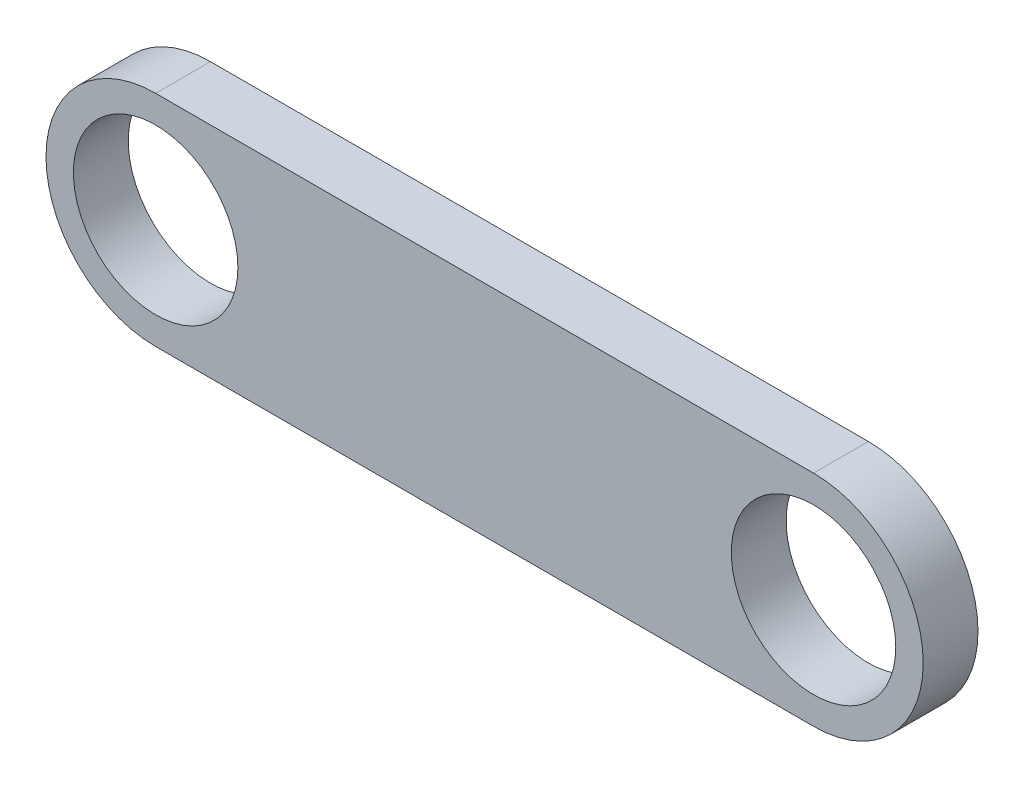
ISO-10303-21;
HEADER;
FILE_DESCRIPTION(('STEP AP214'),'2;1');
FILE_NAME('part.step','',(''),(''),'','','');
FILE_SCHEMA(('AUTOMOTIVE_DESIGN { 1 0 10303 214 1 1 1 1 }'));
ENDSEC;
DATA;
#1=APPLICATION_CONTEXT('core data for automotive mechanical design processes');
#2=APPLICATION_PROTOCOL_DEFINITION('international standard','automotive_design',2000,#1);
#3=PRODUCT_CONTEXT('',#1,'mechanical');
#4=PRODUCT('Part','Part','',(#3));
#5=PRODUCT_RELATED_PRODUCT_CATEGORY('part','',(#4));
#6=PRODUCT_DEFINITION_FORMATION('','',#4);
#7=PRODUCT_DEFINITION_CONTEXT('part definition',#1,'design');
#8=PRODUCT_DEFINITION('design','',#6,#7);
#9=PRODUCT_DEFINITION_SHAPE('','',#8);
#10=(LENGTH_UNIT() NAMED_UNIT(*) SI_UNIT(.MILLI.,.METRE.));
#11=(NAMED_UNIT(*) PLANE_ANGLE_UNIT() SI_UNIT($,.RADIAN.));
#12=(NAMED_UNIT(*) SI_UNIT($,.STERADIAN.) SOLID_ANGLE_UNIT());
#13=UNCERTAINTY_MEASURE_WITH_UNIT(LENGTH_MEASURE(1.E-05),#10,'distance_accuracy_value','');
#14=(GEOMETRIC_REPRESENTATION_CONTEXT(3) GLOBAL_UNCERTAINTY_ASSIGNED_CONTEXT((#13)) GLOBAL_UNIT_ASSIGNED_CONTEXT((#10,
#11,#12)) REPRESENTATION_CONTEXT('',''));
#15=CARTESIAN_POINT('',(0.,0.,0.));
#16=DIRECTION('',(0.,0.,1.));
#17=DIRECTION('',(1.,0.,0.));
#18=AXIS2_PLACEMENT_3D('',#15,#16,#17);
#19=CARTESIAN_POINT('',(0.,0.,10.));
#20=DIRECTION('',(0.,0.,1.));
#21=DIRECTION('',(1.,0.,0.));
#22=AXIS2_PLACEMENT_3D('',#19,#20,#21);
#23=PLANE('',#22);
#24=CARTESIAN_POINT('',(0.,0.,10.));
#25=DIRECTION('',(0.,0.,1.));
#26=DIRECTION('',(1.,0.,0.));
#27=AXIS2_PLACEMENT_3D('',#24,#25,#26);
#28=CIRCLE('',#27,15.);
#29=CARTESIAN_POINT('',(15.,0.,10.));
#30=VERTEX_POINT('',#29);
#31=EDGE_CURVE('E116',#30,#30,#28,.T.);
#32=ORIENTED_EDGE('',*,*,#31,.F.);
#33=EDGE_LOOP('',(#32));
#34=FACE_BOUND('',#33,.T.);
#35=CARTESIAN_POINT('',(0.,0.,10.));
#36=DIRECTION('',(0.,0.,1.));
#37=DIRECTION('',(1.,0.,0.));
#38=AXIS2_PLACEMENT_3D('',#35,#36,#37);
#39=CIRCLE('',#38,20.);
#40=CARTESIAN_POINT('',(0.,20.,10.));
#41=VERTEX_POINT('',#40);
#42=CARTESIAN_POINT('',(0.,-20.,10.));
#43=VERTEX_POINT('',#42);
#44=EDGE_CURVE('E96',#41,#43,#39,.T.);
#45=ORIENTED_EDGE('',*,*,#44,.T.);
#46=DIRECTION('',(1.,0.,0.));
#47=VECTOR('',#46,1.);
#48=CARTESIAN_POINT('',(0.,-20.,10.));
#49=LINE('',#48,#47);
#50=CARTESIAN_POINT('',(120.,-20.,10.));
#51=VERTEX_POINT('',#50);
#52=EDGE_CURVE('E91',#43,#51,#49,.T.);
#53=ORIENTED_EDGE('',*,*,#52,.T.);
#54=CARTESIAN_POINT('',(120.,0.,10.));
#55=DIRECTION('',(0.,0.,1.));
#56=DIRECTION('',(1.,0.,0.));
#57=AXIS2_PLACEMENT_3D('',#54,#55,#56);
#58=CIRCLE('',#57,20.);
#59=CARTESIAN_POINT('',(120.,20.,10.));
#60=VERTEX_POINT('',#59);
#61=EDGE_CURVE('E94',#51,#60,#58,.T.);
#62=ORIENTED_EDGE('',*,*,#61,.T.);
#63=DIRECTION('',(-1.,0.,0.));
#64=VECTOR('',#63,1.);
#65=CARTESIAN_POINT('',(0.,20.,10.));
#66=LINE('',#65,#64);
#67=EDGE_CURVE('E61',#60,#41,#66,.T.);
#68=ORIENTED_EDGE('',*,*,#67,.T.);
#69=EDGE_LOOP('',(#45,#53,#62,#68));
#70=FACE_BOUND('',#69,.T.);
#71=CARTESIAN_POINT('',(120.,0.,10.));
#72=DIRECTION('',(0.,0.,1.));
#73=DIRECTION('',(1.,0.,0.));
#74=AXIS2_PLACEMENT_3D('',#71,#72,#73);
#75=CIRCLE('',#74,15.);
#76=CARTESIAN_POINT('',(135.,0.,10.));
#77=VERTEX_POINT('',#76);
#78=EDGE_CURVE('E138',#77,#77,#75,.T.);
#79=ORIENTED_EDGE('',*,*,#78,.F.);
#80=EDGE_LOOP('',(#79));
#81=FACE_BOUND('',#80,.T.);
#82=ADVANCED_FACE('F43',(#34,#70,#81),#23,.T.);
#83=CARTESIAN_POINT('',(0.,0.,0.));
#84=DIRECTION('',(0.,0.,1.));
#85=DIRECTION('',(1.,0.,0.));
#86=AXIS2_PLACEMENT_3D('',#83,#84,#85);
#87=PLANE('',#86);
#88=CARTESIAN_POINT('',(0.,0.,0.));
#89=DIRECTION('',(0.,0.,1.));
#90=DIRECTION('',(1.,0.,0.));
#91=AXIS2_PLACEMENT_3D('',#88,#89,#90);
#92=CIRCLE('',#91,20.);
#93=CARTESIAN_POINT('',(0.,20.,0.));
#94=VERTEX_POINT('',#93);
#95=CARTESIAN_POINT('',(0.,-20.,0.));
#96=VERTEX_POINT('',#95);
#97=EDGE_CURVE('E112',#94,#96,#92,.T.);
#98=ORIENTED_EDGE('',*,*,#97,.F.);
#99=DIRECTION('',(-1.,0.,0.));
#100=VECTOR('',#99,1.);
#101=CARTESIAN_POINT('',(0.,20.,0.));
#102=LINE('',#101,#100);
#103=CARTESIAN_POINT('',(120.,20.,0.));
#104=VERTEX_POINT('',#103);
#105=EDGE_CURVE('E84',#104,#94,#102,.T.);
#106=ORIENTED_EDGE('',*,*,#105,.F.);
#107=CARTESIAN_POINT('',(120.,0.,0.));
#108=DIRECTION('',(0.,0.,1.));
#109=DIRECTION('',(1.,0.,0.));
#110=AXIS2_PLACEMENT_3D('',#107,#108,#109);
#111=CIRCLE('',#110,20.);
#112=CARTESIAN_POINT('',(120.,-20.,0.));
#113=VERTEX_POINT('',#112);
#114=EDGE_CURVE('E78',#113,#104,#111,.T.);
#115=ORIENTED_EDGE('',*,*,#114,.F.);
#116=DIRECTION('',(1.,0.,0.));
#117=VECTOR('',#116,1.);
#118=CARTESIAN_POINT('',(0.,-20.,0.));
#119=LINE('',#118,#117);
#120=EDGE_CURVE('E101',#96,#113,#119,.T.);
#121=ORIENTED_EDGE('',*,*,#120,.F.);
#122=EDGE_LOOP('',(#98,#106,#115,#121));
#123=FACE_BOUND('',#122,.T.);
#124=CARTESIAN_POINT('',(0.,0.,0.));
#125=DIRECTION('',(0.,0.,1.));
#126=DIRECTION('',(1.,0.,0.));
#127=AXIS2_PLACEMENT_3D('',#124,#125,#126);
#128=CIRCLE('',#127,15.);
#129=CARTESIAN_POINT('',(15.,0.,0.));
#130=VERTEX_POINT('',#129);
#131=EDGE_CURVE('E134',#130,#130,#128,.T.);
#132=ORIENTED_EDGE('',*,*,#131,.T.);
#133=EDGE_LOOP('',(#132));
#134=FACE_BOUND('',#133,.T.);
#135=CARTESIAN_POINT('',(120.,0.,0.));
#136=DIRECTION('',(0.,0.,1.));
#137=DIRECTION('',(1.,0.,0.));
#138=AXIS2_PLACEMENT_3D('',#135,#136,#137);
#139=CIRCLE('',#138,15.);
#140=CARTESIAN_POINT('',(135.,0.,0.));
#141=VERTEX_POINT('',#140);
#142=EDGE_CURVE('E142',#141,#141,#139,.T.);
#143=ORIENTED_EDGE('',*,*,#142,.T.);
#144=EDGE_LOOP('',(#143));
#145=FACE_BOUND('',#144,.T.);
#146=ADVANCED_FACE('F129',(#123,#134,#145),#87,.F.);
#147=CARTESIAN_POINT('',(0.,0.,10.));
#148=DIRECTION('',(0.,0.,-1.));
#149=DIRECTION('',(-1.,0.,0.));
#150=AXIS2_PLACEMENT_3D('',#147,#148,#149);
#151=CYLINDRICAL_SURFACE('',#150,20.);
#152=ORIENTED_EDGE('',*,*,#97,.T.);
#153=DIRECTION('',(0.,0.,-1.));
#154=VECTOR('',#153,1.);
#155=CARTESIAN_POINT('',(0.,-20.,10.));
#156=LINE('',#155,#154);
#157=EDGE_CURVE('E11',#43,#96,#156,.T.);
#158=ORIENTED_EDGE('',*,*,#157,.F.);
#159=ORIENTED_EDGE('',*,*,#44,.F.);
#160=DIRECTION('',(0.,0.,-1.));
#161=VECTOR('',#160,1.);
#162=CARTESIAN_POINT('',(0.,20.,10.));
#163=LINE('',#162,#161);
#164=EDGE_CURVE('E108',#41,#94,#163,.T.);
#165=ORIENTED_EDGE('',*,*,#164,.T.);
#166=EDGE_LOOP('',(#152,#158,#159,#165));
#167=FACE_BOUND('',#166,.T.);
#168=ADVANCED_FACE('F45',(#167),#151,.T.);
#169=CARTESIAN_POINT('',(0.,-20.,10.));
#170=DIRECTION('',(0.,1.,0.));
#171=DIRECTION('',(-1.,0.,0.));
#172=AXIS2_PLACEMENT_3D('',#169,#170,#171);
#173=PLANE('',#172);
#174=ORIENTED_EDGE('',*,*,#120,.T.);
#175=DIRECTION('',(0.,0.,-1.));
#176=VECTOR('',#175,1.);
#177=CARTESIAN_POINT('',(120.,-20.,10.));
#178=LINE('',#177,#176);
#179=EDGE_CURVE('E53',#51,#113,#178,.T.);
#180=ORIENTED_EDGE('',*,*,#179,.F.);
#181=ORIENTED_EDGE('',*,*,#52,.F.);
#182=ORIENTED_EDGE('',*,*,#157,.T.);
#183=EDGE_LOOP('',(#174,#180,#181,#182));
#184=FACE_BOUND('',#183,.T.);
#185=ADVANCED_FACE('F100',(#184),#173,.F.);
#186=CARTESIAN_POINT('',(120.,0.,10.));
#187=DIRECTION('',(0.,0.,-1.));
#188=DIRECTION('',(-1.,0.,0.));
#189=AXIS2_PLACEMENT_3D('',#186,#187,#188);
#190=CYLINDRICAL_SURFACE('',#189,20.);
#191=ORIENTED_EDGE('',*,*,#114,.T.);
#192=DIRECTION('',(0.,0.,-1.));
#193=VECTOR('',#192,1.);
#194=CARTESIAN_POINT('',(120.,20.,10.));
#195=LINE('',#194,#193);
#196=EDGE_CURVE('E103',#60,#104,#195,.T.);
#197=ORIENTED_EDGE('',*,*,#196,.F.);
#198=ORIENTED_EDGE('',*,*,#61,.F.);
#199=ORIENTED_EDGE('',*,*,#179,.T.);
#200=EDGE_LOOP('',(#191,#197,#198,#199));
#201=FACE_BOUND('',#200,.T.);
#202=ADVANCED_FACE('F104',(#201),#190,.T.);
#203=CARTESIAN_POINT('',(0.,20.,10.));
#204=DIRECTION('',(0.,-1.,0.));
#205=DIRECTION('',(1.,0.,0.));
#206=AXIS2_PLACEMENT_3D('',#203,#204,#205);
#207=PLANE('',#206);
#208=ORIENTED_EDGE('',*,*,#105,.T.);
#209=ORIENTED_EDGE('',*,*,#164,.F.);
#210=ORIENTED_EDGE('',*,*,#67,.F.);
#211=ORIENTED_EDGE('',*,*,#196,.T.);
#212=EDGE_LOOP('',(#208,#209,#210,#211));
#213=FACE_BOUND('',#212,.T.);
#214=ADVANCED_FACE('F126',(#213),#207,.F.);
#215=CARTESIAN_POINT('',(0.,0.,10.));
#216=DIRECTION('',(0.,0.,-1.));
#217=DIRECTION('',(-1.,0.,0.));
#218=AXIS2_PLACEMENT_3D('',#215,#216,#217);
#219=CYLINDRICAL_SURFACE('',#218,15.);
#220=ORIENTED_EDGE('',*,*,#31,.T.);
#221=EDGE_LOOP('',(#220));
#222=FACE_BOUND('',#221,.T.);
#223=ORIENTED_EDGE('',*,*,#131,.F.);
#224=EDGE_LOOP('',(#223));
#225=FACE_BOUND('',#224,.T.);
#226=ADVANCED_FACE('F161',(#222,#225),#219,.F.);
#227=CARTESIAN_POINT('',(120.,0.,10.));
#228=DIRECTION('',(0.,0.,-1.));
#229=DIRECTION('',(-1.,0.,0.));
#230=AXIS2_PLACEMENT_3D('',#227,#228,#229);
#231=CYLINDRICAL_SURFACE('',#230,15.);
#232=ORIENTED_EDGE('',*,*,#78,.T.);
#233=EDGE_LOOP('',(#232));
#234=FACE_BOUND('',#233,.T.);
#235=ORIENTED_EDGE('',*,*,#142,.F.);
#236=EDGE_LOOP('',(#235));
#237=FACE_BOUND('',#236,.T.);
#238=ADVANCED_FACE('F150',(#234,#237),#231,.F.);
#239=CLOSED_SHELL('',(#82,#146,#168,#185,#202,#214,#226,#238));
#240=MANIFOLD_SOLID_BREP('B2',#239);
#241=ADVANCED_BREP_SHAPE_REPRESENTATION('',(#18,#240),#14);
#242=SHAPE_DEFINITION_REPRESENTATION(#9,#241);
ENDSEC;
END-ISO-10303-21;
